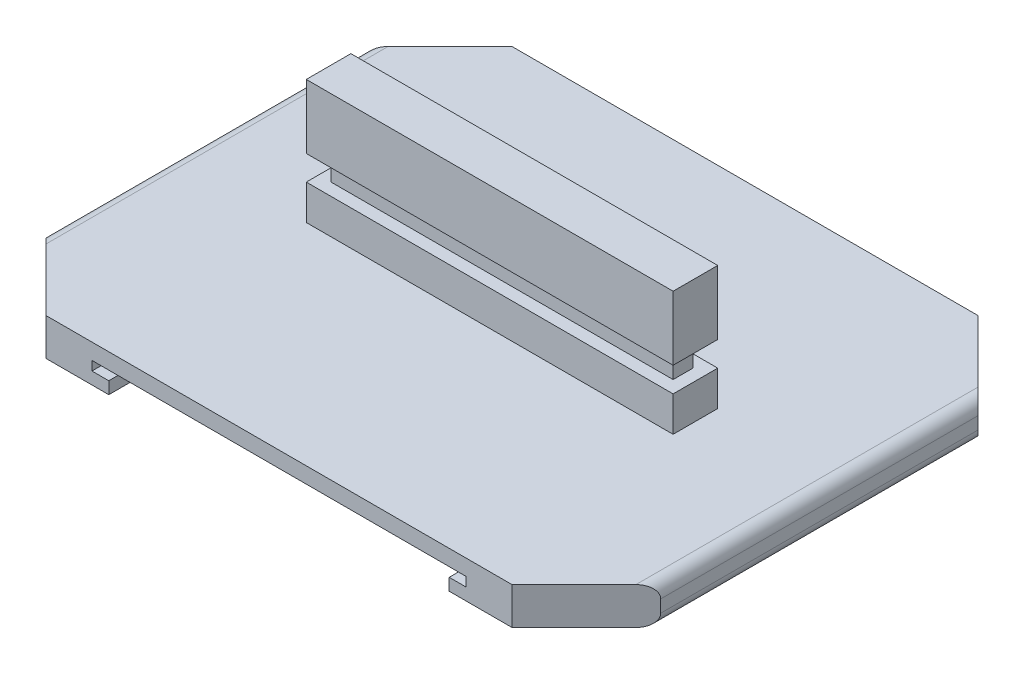
ISO-10303-21;
HEADER;
FILE_DESCRIPTION(('STEP AP214'),'2;1');
FILE_NAME('part.step','',(''),(''),'','','');
FILE_SCHEMA(('AUTOMOTIVE_DESIGN { 1 0 10303 214 1 1 1 1 }'));
ENDSEC;
DATA;
#1=APPLICATION_CONTEXT('core data for automotive mechanical design processes');
#2=APPLICATION_PROTOCOL_DEFINITION('international standard','automotive_design',2000,#1);
#3=PRODUCT_CONTEXT('',#1,'mechanical');
#4=PRODUCT('Part','Part','',(#3));
#5=PRODUCT_RELATED_PRODUCT_CATEGORY('part','',(#4));
#6=PRODUCT_DEFINITION_FORMATION('','',#4);
#7=PRODUCT_DEFINITION_CONTEXT('part definition',#1,'design');
#8=PRODUCT_DEFINITION('design','',#6,#7);
#9=PRODUCT_DEFINITION_SHAPE('','',#8);
#10=(LENGTH_UNIT() NAMED_UNIT(*) SI_UNIT(.MILLI.,.METRE.));
#11=(NAMED_UNIT(*) PLANE_ANGLE_UNIT() SI_UNIT($,.RADIAN.));
#12=(NAMED_UNIT(*) SI_UNIT($,.STERADIAN.) SOLID_ANGLE_UNIT());
#13=UNCERTAINTY_MEASURE_WITH_UNIT(LENGTH_MEASURE(1.E-05),#10,'distance_accuracy_value','');
#14=(GEOMETRIC_REPRESENTATION_CONTEXT(3) GLOBAL_UNCERTAINTY_ASSIGNED_CONTEXT((#13)) GLOBAL_UNIT_ASSIGNED_CONTEXT((#10,
#11,#12)) REPRESENTATION_CONTEXT('',''));
#15=CARTESIAN_POINT('',(0.,0.,0.));
#16=DIRECTION('',(0.,0.,1.));
#17=DIRECTION('',(1.,0.,0.));
#18=AXIS2_PLACEMENT_3D('',#15,#16,#17);
#19=CARTESIAN_POINT('',(0.,1.5,0.));
#20=DIRECTION('',(0.,-1.,0.));
#21=DIRECTION('',(0.,0.,-1.));
#22=AXIS2_PLACEMENT_3D('',#19,#20,#21);
#23=PLANE('',#22);
#24=DIRECTION('',(0.,0.,-1.));
#25=VECTOR('',#24,1.);
#26=CARTESIAN_POINT('',(7.4,1.5,0.9));
#27=LINE('',#26,#25);
#28=CARTESIAN_POINT('',(7.4,1.5,0.9));
#29=VERTEX_POINT('',#28);
#30=CARTESIAN_POINT('',(7.4,1.5,-0.9));
#31=VERTEX_POINT('',#30);
#32=EDGE_CURVE('E456',#29,#31,#27,.T.);
#33=ORIENTED_EDGE('',*,*,#32,.F.);
#34=DIRECTION('',(1.,0.,0.));
#35=VECTOR('',#34,1.);
#36=CARTESIAN_POINT('',(-7.4,1.5,0.9));
#37=LINE('',#36,#35);
#38=CARTESIAN_POINT('',(-7.4,1.5,0.9));
#39=VERTEX_POINT('',#38);
#40=EDGE_CURVE('E443',#39,#29,#37,.T.);
#41=ORIENTED_EDGE('',*,*,#40,.F.);
#42=DIRECTION('',(0.,0.,1.));
#43=VECTOR('',#42,1.);
#44=CARTESIAN_POINT('',(-7.4,1.5,0.9));
#45=LINE('',#44,#43);
#46=CARTESIAN_POINT('',(-7.4,1.5,-0.9));
#47=VERTEX_POINT('',#46);
#48=EDGE_CURVE('E448',#47,#39,#45,.T.);
#49=ORIENTED_EDGE('',*,*,#48,.F.);
#50=DIRECTION('',(-1.,0.,0.));
#51=VECTOR('',#50,1.);
#52=CARTESIAN_POINT('',(-7.4,1.5,-0.9));
#53=LINE('',#52,#51);
#54=EDGE_CURVE('E452',#31,#47,#53,.T.);
#55=ORIENTED_EDGE('',*,*,#54,.F.);
#56=EDGE_LOOP('',(#33,#41,#49,#55));
#57=FACE_BOUND('',#56,.T.);
#58=DIRECTION('',(0.707106781186547,0.,-0.707106781186548));
#59=VECTOR('',#58,1.);
#60=CARTESIAN_POINT('',(9.4,1.5,9.4));
#61=LINE('',#60,#59);
#62=CARTESIAN_POINT('',(9.4,1.5,9.4));
#63=VERTEX_POINT('',#62);
#64=CARTESIAN_POINT('',(11.9,1.5,6.9));
#65=VERTEX_POINT('',#64);
#66=EDGE_CURVE('E415',#63,#65,#61,.T.);
#67=ORIENTED_EDGE('',*,*,#66,.T.);
#68=DIRECTION('',(0.,0.,1.));
#69=VECTOR('',#68,1.);
#70=CARTESIAN_POINT('',(11.9,1.5,-10.1));
#71=LINE('',#70,#69);
#72=CARTESIAN_POINT('',(11.9,1.5,-6.9));
#73=VERTEX_POINT('',#72);
#74=EDGE_CURVE('E604',#73,#65,#71,.T.);
#75=ORIENTED_EDGE('',*,*,#74,.F.);
#76=DIRECTION('',(-0.707106781186547,0.,-0.707106781186548));
#77=VECTOR('',#76,1.);
#78=CARTESIAN_POINT('',(9.4,1.5,-9.4));
#79=LINE('',#78,#77);
#80=CARTESIAN_POINT('',(9.4,1.5,-9.4));
#81=VERTEX_POINT('',#80);
#82=EDGE_CURVE('E412',#73,#81,#79,.T.);
#83=ORIENTED_EDGE('',*,*,#82,.T.);
#84=DIRECTION('',(-1.,0.,0.));
#85=VECTOR('',#84,1.);
#86=CARTESIAN_POINT('',(-9.4,1.5,-9.4));
#87=LINE('',#86,#85);
#88=CARTESIAN_POINT('',(-9.4,1.5,-9.4));
#89=VERTEX_POINT('',#88);
#90=EDGE_CURVE('E389',#81,#89,#87,.T.);
#91=ORIENTED_EDGE('',*,*,#90,.T.);
#92=DIRECTION('',(-0.707106781186547,0.,0.707106781186548));
#93=VECTOR('',#92,1.);
#94=CARTESIAN_POINT('',(-12.4,1.5,-6.4));
#95=LINE('',#94,#93);
#96=CARTESIAN_POINT('',(-11.9,1.5,-6.9));
#97=VERTEX_POINT('',#96);
#98=EDGE_CURVE('E305',#89,#97,#95,.T.);
#99=ORIENTED_EDGE('',*,*,#98,.T.);
#100=DIRECTION('',(0.,0.,1.));
#101=VECTOR('',#100,1.);
#102=CARTESIAN_POINT('',(-11.9,1.5,-10.1));
#103=LINE('',#102,#101);
#104=CARTESIAN_POINT('',(-11.9,1.5,6.9));
#105=VERTEX_POINT('',#104);
#106=EDGE_CURVE('E67',#97,#105,#103,.T.);
#107=ORIENTED_EDGE('',*,*,#106,.T.);
#108=DIRECTION('',(0.707106781186547,0.,0.707106781186548));
#109=VECTOR('',#108,1.);
#110=CARTESIAN_POINT('',(-12.4,1.5,6.4));
#111=LINE('',#110,#109);
#112=CARTESIAN_POINT('',(-9.4,1.5,9.4));
#113=VERTEX_POINT('',#112);
#114=EDGE_CURVE('E299',#105,#113,#111,.T.);
#115=ORIENTED_EDGE('',*,*,#114,.T.);
#116=DIRECTION('',(1.,0.,0.));
#117=VECTOR('',#116,1.);
#118=CARTESIAN_POINT('',(-9.4,1.5,9.4));
#119=LINE('',#118,#117);
#120=EDGE_CURVE('E419',#113,#63,#119,.T.);
#121=ORIENTED_EDGE('',*,*,#120,.T.);
#122=EDGE_LOOP('',(#67,#75,#83,#91,#99,#107,#115,#121));
#123=FACE_BOUND('',#122,.T.);
#124=ADVANCED_FACE('F44',(#57,#123),#23,.F.);
#125=CARTESIAN_POINT('',(-12.4,1.5,6.4));
#126=DIRECTION('',(0.707106781186548,0.,-0.707106781186547));
#127=DIRECTION('',(-0.707106781186547,0.,-0.707106781186548));
#128=AXIS2_PLACEMENT_3D('',#125,#126,#127);
#129=PLANE('',#128);
#130=CARTESIAN_POINT('',(-11.9,0.5,6.9));
#131=DIRECTION('',(0.707106781186548,0.,-0.707106781186547));
#132=DIRECTION('',(0.707106781186547,0.,0.707106781186548));
#133=AXIS2_PLACEMENT_3D('',#130,#131,#132);
#134=ELLIPSE('',#133,0.707106781186548,0.5);
#135=CARTESIAN_POINT('',(-11.9,0.,6.9));
#136=VERTEX_POINT('',#135);
#137=CARTESIAN_POINT('',(-12.4,0.500000000000004,6.4));
#138=VERTEX_POINT('',#137);
#139=EDGE_CURVE('E590',#136,#138,#134,.T.);
#140=ORIENTED_EDGE('',*,*,#139,.F.);
#141=DIRECTION('',(0.707106781186547,0.,0.707106781186548));
#142=VECTOR('',#141,1.);
#143=CARTESIAN_POINT('',(-12.4,0.,6.4));
#144=LINE('',#143,#142);
#145=CARTESIAN_POINT('',(-9.4,0.,9.4));
#146=VERTEX_POINT('',#145);
#147=EDGE_CURVE('E378',#136,#146,#144,.T.);
#148=ORIENTED_EDGE('',*,*,#147,.T.);
#149=DIRECTION('',(0.,-1.,0.));
#150=VECTOR('',#149,1.);
#151=CARTESIAN_POINT('',(-9.4,1.5,9.4));
#152=LINE('',#151,#150);
#153=EDGE_CURVE('E322',#113,#146,#152,.T.);
#154=ORIENTED_EDGE('',*,*,#153,.F.);
#155=ORIENTED_EDGE('',*,*,#114,.F.);
#156=CARTESIAN_POINT('',(-11.9,1.,6.9));
#157=DIRECTION('',(0.707106781186548,0.,-0.707106781186547));
#158=DIRECTION('',(0.707106781186547,0.,0.707106781186548));
#159=AXIS2_PLACEMENT_3D('',#156,#157,#158);
#160=ELLIPSE('',#159,0.707106781186548,0.5);
#161=CARTESIAN_POINT('',(-12.4,0.999999999999997,6.4));
#162=VERTEX_POINT('',#161);
#163=EDGE_CURVE('E593',#105,#162,#160,.F.);
#164=ORIENTED_EDGE('',*,*,#163,.T.);
#165=DIRECTION('',(0.,-1.,0.));
#166=VECTOR('',#165,1.);
#167=CARTESIAN_POINT('',(-12.4,1.5,6.4));
#168=LINE('',#167,#166);
#169=EDGE_CURVE('E326',#162,#138,#168,.T.);
#170=ORIENTED_EDGE('',*,*,#169,.T.);
#171=EDGE_LOOP('',(#140,#148,#154,#155,#164,#170));
#172=FACE_BOUND('',#171,.T.);
#173=ADVANCED_FACE('F616',(#172),#129,.F.);
#174=CARTESIAN_POINT('',(12.4,1.5,6.4));
#175=DIRECTION('',(-1.,0.,0.));
#176=DIRECTION('',(0.,0.,1.));
#177=AXIS2_PLACEMENT_3D('',#174,#175,#176);
#178=PLANE('',#177);
#179=DIRECTION('',(0.,-1.,0.));
#180=VECTOR('',#179,1.);
#181=CARTESIAN_POINT('',(12.4,1.5,6.4));
#182=LINE('',#181,#180);
#183=CARTESIAN_POINT('',(12.4,0.999999999999997,6.4));
#184=VERTEX_POINT('',#183);
#185=CARTESIAN_POINT('',(12.4,0.500000000000004,6.4));
#186=VERTEX_POINT('',#185);
#187=EDGE_CURVE('E314',#184,#186,#182,.T.);
#188=ORIENTED_EDGE('',*,*,#187,.T.);
#189=DIRECTION('',(0.,0.,1.));
#190=VECTOR('',#189,1.);
#191=CARTESIAN_POINT('',(12.4,0.500000000000004,-10.1));
#192=LINE('',#191,#190);
#193=CARTESIAN_POINT('',(12.4,0.500000000000004,-6.4));
#194=VERTEX_POINT('',#193);
#195=EDGE_CURVE('E265',#194,#186,#192,.T.);
#196=ORIENTED_EDGE('',*,*,#195,.F.);
#197=DIRECTION('',(0.,-1.,0.));
#198=VECTOR('',#197,1.);
#199=CARTESIAN_POINT('',(12.4,1.5,-6.4));
#200=LINE('',#199,#198);
#201=CARTESIAN_POINT('',(12.4,1.,-6.4));
#202=VERTEX_POINT('',#201);
#203=EDGE_CURVE('E274',#202,#194,#200,.T.);
#204=ORIENTED_EDGE('',*,*,#203,.F.);
#205=DIRECTION('',(0.,0.,1.));
#206=VECTOR('',#205,1.);
#207=CARTESIAN_POINT('',(12.4,0.999999999999997,-10.1));
#208=LINE('',#207,#206);
#209=EDGE_CURVE('E60',#202,#184,#208,.T.);
#210=ORIENTED_EDGE('',*,*,#209,.T.);
#211=EDGE_LOOP('',(#188,#196,#204,#210));
#212=FACE_BOUND('',#211,.T.);
#213=ADVANCED_FACE('F636',(#212),#178,.F.);
#214=CARTESIAN_POINT('',(-12.4,1.5,-6.4));
#215=DIRECTION('',(0.707106781186548,0.,0.707106781186547));
#216=DIRECTION('',(0.707106781186547,0.,-0.707106781186548));
#217=AXIS2_PLACEMENT_3D('',#214,#215,#216);
#218=PLANE('',#217);
#219=CARTESIAN_POINT('',(-11.9,0.5,-6.9));
#220=DIRECTION('',(0.707106781186548,0.,0.707106781186547));
#221=DIRECTION('',(-0.707106781186547,0.,0.707106781186548));
#222=AXIS2_PLACEMENT_3D('',#219,#220,#221);
#223=ELLIPSE('',#222,0.707106781186548,0.5);
#224=CARTESIAN_POINT('',(-12.4,0.5,-6.4));
#225=VERTEX_POINT('',#224);
#226=CARTESIAN_POINT('',(-11.9,0.,-6.9));
#227=VERTEX_POINT('',#226);
#228=EDGE_CURVE('E53',#225,#227,#223,.T.);
#229=ORIENTED_EDGE('',*,*,#228,.F.);
#230=DIRECTION('',(0.,-1.,0.));
#231=VECTOR('',#230,1.);
#232=CARTESIAN_POINT('',(-12.4,1.5,-6.4));
#233=LINE('',#232,#231);
#234=CARTESIAN_POINT('',(-12.4,0.999999999999997,-6.4));
#235=VERTEX_POINT('',#234);
#236=EDGE_CURVE('E300',#235,#225,#233,.T.);
#237=ORIENTED_EDGE('',*,*,#236,.F.);
#238=CARTESIAN_POINT('',(-11.9,1.,-6.9));
#239=DIRECTION('',(0.707106781186548,0.,0.707106781186547));
#240=DIRECTION('',(-0.707106781186547,0.,0.707106781186548));
#241=AXIS2_PLACEMENT_3D('',#238,#239,#240);
#242=ELLIPSE('',#241,0.707106781186548,0.5);
#243=EDGE_CURVE('E361',#235,#97,#242,.F.);
#244=ORIENTED_EDGE('',*,*,#243,.T.);
#245=ORIENTED_EDGE('',*,*,#98,.F.);
#246=DIRECTION('',(0.,-1.,0.));
#247=VECTOR('',#246,1.);
#248=CARTESIAN_POINT('',(-9.4,1.5,-9.4));
#249=LINE('',#248,#247);
#250=CARTESIAN_POINT('',(-9.4,0.,-9.4));
#251=VERTEX_POINT('',#250);
#252=EDGE_CURVE('E304',#89,#251,#249,.T.);
#253=ORIENTED_EDGE('',*,*,#252,.T.);
#254=DIRECTION('',(-0.707106781186547,0.,0.707106781186548));
#255=VECTOR('',#254,1.);
#256=CARTESIAN_POINT('',(-12.4,0.,-6.4));
#257=LINE('',#256,#255);
#258=EDGE_CURVE('E295',#251,#227,#257,.T.);
#259=ORIENTED_EDGE('',*,*,#258,.T.);
#260=EDGE_LOOP('',(#229,#237,#244,#245,#253,#259));
#261=FACE_BOUND('',#260,.T.);
#262=ADVANCED_FACE('F381',(#261),#218,.F.);
#263=CARTESIAN_POINT('',(-9.4,1.5,9.4));
#264=DIRECTION('',(0.,0.,-1.));
#265=DIRECTION('',(-1.,0.,0.));
#266=AXIS2_PLACEMENT_3D('',#263,#264,#265);
#267=PLANE('',#266);
#268=DIRECTION('',(0.,1.,0.));
#269=VECTOR('',#268,1.);
#270=CARTESIAN_POINT('',(-6.86704008418104,0.,9.4));
#271=LINE('',#270,#269);
#272=CARTESIAN_POINT('',(-6.86704008418104,0.,9.4));
#273=VERTEX_POINT('',#272);
#274=CARTESIAN_POINT('',(-6.86704008418104,0.488052506575798,9.4));
#275=VERTEX_POINT('',#274);
#276=EDGE_CURVE('E398',#273,#275,#271,.T.);
#277=ORIENTED_EDGE('',*,*,#276,.T.);
#278=DIRECTION('',(-1.,0.,0.));
#279=VECTOR('',#278,1.);
#280=CARTESIAN_POINT('',(0.,0.488052506575798,9.4));
#281=LINE('',#280,#279);
#282=CARTESIAN_POINT('',(-7.54709683395956,0.488052506575798,9.4));
#283=VERTEX_POINT('',#282);
#284=EDGE_CURVE('E563',#275,#283,#281,.T.);
#285=ORIENTED_EDGE('',*,*,#284,.T.);
#286=DIRECTION('',(0.,-1.,0.));
#287=VECTOR('',#286,1.);
#288=CARTESIAN_POINT('',(-7.54709683395956,0.,9.4));
#289=LINE('',#288,#287);
#290=CARTESIAN_POINT('',(-7.54709683395956,0.859235202927271,9.4));
#291=VERTEX_POINT('',#290);
#292=EDGE_CURVE('E566',#291,#283,#289,.T.);
#293=ORIENTED_EDGE('',*,*,#292,.F.);
#294=DIRECTION('',(1.,0.,0.));
#295=VECTOR('',#294,1.);
#296=CARTESIAN_POINT('',(0.,0.859235202927271,9.4));
#297=LINE('',#296,#295);
#298=CARTESIAN_POINT('',(7.54709683395956,0.859235202927271,9.4));
#299=VERTEX_POINT('',#298);
#300=EDGE_CURVE('E570',#291,#299,#297,.T.);
#301=ORIENTED_EDGE('',*,*,#300,.T.);
#302=DIRECTION('',(0.,-1.,0.));
#303=VECTOR('',#302,1.);
#304=CARTESIAN_POINT('',(7.54709683395956,0.,9.4));
#305=LINE('',#304,#303);
#306=CARTESIAN_POINT('',(7.54709683395956,0.488052506575798,9.4));
#307=VERTEX_POINT('',#306);
#308=EDGE_CURVE('E574',#299,#307,#305,.T.);
#309=ORIENTED_EDGE('',*,*,#308,.T.);
#310=DIRECTION('',(1.,0.,0.));
#311=VECTOR('',#310,1.);
#312=CARTESIAN_POINT('',(0.,0.488052506575798,9.4));
#313=LINE('',#312,#311);
#314=CARTESIAN_POINT('',(6.86704008418104,0.488052506575798,9.4));
#315=VERTEX_POINT('',#314);
#316=EDGE_CURVE('E578',#315,#307,#313,.T.);
#317=ORIENTED_EDGE('',*,*,#316,.F.);
#318=DIRECTION('',(0.,1.,0.));
#319=VECTOR('',#318,1.);
#320=CARTESIAN_POINT('',(6.86704008418104,0.,9.4));
#321=LINE('',#320,#319);
#322=CARTESIAN_POINT('',(6.86704008418104,0.,9.4));
#323=VERTEX_POINT('',#322);
#324=EDGE_CURVE('E582',#323,#315,#321,.T.);
#325=ORIENTED_EDGE('',*,*,#324,.F.);
#326=DIRECTION('',(1.,0.,0.));
#327=VECTOR('',#326,1.);
#328=CARTESIAN_POINT('',(-9.4,0.,9.4));
#329=LINE('',#328,#327);
#330=CARTESIAN_POINT('',(9.4,0.,9.4));
#331=VERTEX_POINT('',#330);
#332=EDGE_CURVE('E402',#323,#331,#329,.T.);
#333=ORIENTED_EDGE('',*,*,#332,.T.);
#334=DIRECTION('',(0.,-1.,0.));
#335=VECTOR('',#334,1.);
#336=CARTESIAN_POINT('',(9.4,1.5,9.4));
#337=LINE('',#336,#335);
#338=EDGE_CURVE('E318',#63,#331,#337,.T.);
#339=ORIENTED_EDGE('',*,*,#338,.F.);
#340=ORIENTED_EDGE('',*,*,#120,.F.);
#341=ORIENTED_EDGE('',*,*,#153,.T.);
#342=EDGE_CURVE('E290',#146,#273,#329,.T.);
#343=ORIENTED_EDGE('',*,*,#342,.T.);
#344=EDGE_LOOP('',(#277,#285,#293,#301,#309,#317,#325,#333,#339,#340,#341,#343));
#345=FACE_BOUND('',#344,.T.);
#346=ADVANCED_FACE('F396',(#345),#267,.F.);
#347=CARTESIAN_POINT('',(-9.4,1.5,-9.4));
#348=DIRECTION('',(0.,0.,1.));
#349=DIRECTION('',(1.,0.,0.));
#350=AXIS2_PLACEMENT_3D('',#347,#348,#349);
#351=PLANE('',#350);
#352=DIRECTION('',(0.,1.,0.));
#353=VECTOR('',#352,1.);
#354=CARTESIAN_POINT('',(-6.86704008418104,1.5,-9.4));
#355=LINE('',#354,#353);
#356=CARTESIAN_POINT('',(-6.86704008418104,0.,-9.40000000000001));
#357=VERTEX_POINT('',#356);
#358=CARTESIAN_POINT('',(-6.86704008418104,0.488052506575798,-9.40000000000001));
#359=VERTEX_POINT('',#358);
#360=EDGE_CURVE('E391',#357,#359,#355,.T.);
#361=ORIENTED_EDGE('',*,*,#360,.F.);
#362=DIRECTION('',(-1.,0.,0.));
#363=VECTOR('',#362,1.);
#364=CARTESIAN_POINT('',(-9.4,0.,-9.4));
#365=LINE('',#364,#363);
#366=EDGE_CURVE('E284',#357,#251,#365,.T.);
#367=ORIENTED_EDGE('',*,*,#366,.T.);
#368=ORIENTED_EDGE('',*,*,#252,.F.);
#369=ORIENTED_EDGE('',*,*,#90,.F.);
#370=DIRECTION('',(0.,-1.,0.));
#371=VECTOR('',#370,1.);
#372=CARTESIAN_POINT('',(9.4,1.5,-9.4));
#373=LINE('',#372,#371);
#374=CARTESIAN_POINT('',(9.4,0.,-9.4));
#375=VERTEX_POINT('',#374);
#376=EDGE_CURVE('E309',#81,#375,#373,.T.);
#377=ORIENTED_EDGE('',*,*,#376,.T.);
#378=CARTESIAN_POINT('',(6.86704008418104,0.,-9.4));
#379=VERTEX_POINT('',#378);
#380=EDGE_CURVE('E282',#375,#379,#365,.T.);
#381=ORIENTED_EDGE('',*,*,#380,.T.);
#382=DIRECTION('',(0.,1.,0.));
#383=VECTOR('',#382,1.);
#384=CARTESIAN_POINT('',(6.86704008418104,1.5,-9.4));
#385=LINE('',#384,#383);
#386=CARTESIAN_POINT('',(6.86704008418104,0.488052506575798,-9.40000000000001));
#387=VERTEX_POINT('',#386);
#388=EDGE_CURVE('E539',#379,#387,#385,.T.);
#389=ORIENTED_EDGE('',*,*,#388,.T.);
#390=DIRECTION('',(1.,0.,0.));
#391=VECTOR('',#390,1.);
#392=CARTESIAN_POINT('',(-9.4,0.488052506575798,-9.4));
#393=LINE('',#392,#391);
#394=CARTESIAN_POINT('',(7.54709683395956,0.488052506575798,-9.40000000000001));
#395=VERTEX_POINT('',#394);
#396=EDGE_CURVE('E344',#387,#395,#393,.T.);
#397=ORIENTED_EDGE('',*,*,#396,.T.);
#398=DIRECTION('',(0.,-1.,0.));
#399=VECTOR('',#398,1.);
#400=CARTESIAN_POINT('',(7.54709683395956,1.5,-9.4));
#401=LINE('',#400,#399);
#402=CARTESIAN_POINT('',(7.54709683395956,0.859235202927271,-9.40000000000001));
#403=VERTEX_POINT('',#402);
#404=EDGE_CURVE('E348',#403,#395,#401,.T.);
#405=ORIENTED_EDGE('',*,*,#404,.F.);
#406=DIRECTION('',(1.,0.,0.));
#407=VECTOR('',#406,1.);
#408=CARTESIAN_POINT('',(-9.4,0.859235202927271,-9.4));
#409=LINE('',#408,#407);
#410=CARTESIAN_POINT('',(-7.54709683395956,0.859235202927271,-9.40000000000001));
#411=VERTEX_POINT('',#410);
#412=EDGE_CURVE('E351',#411,#403,#409,.T.);
#413=ORIENTED_EDGE('',*,*,#412,.F.);
#414=DIRECTION('',(0.,-1.,0.));
#415=VECTOR('',#414,1.);
#416=CARTESIAN_POINT('',(-7.54709683395956,1.5,-9.4));
#417=LINE('',#416,#415);
#418=CARTESIAN_POINT('',(-7.54709683395956,0.488052506575798,-9.40000000000001));
#419=VERTEX_POINT('',#418);
#420=EDGE_CURVE('E354',#411,#419,#417,.T.);
#421=ORIENTED_EDGE('',*,*,#420,.T.);
#422=DIRECTION('',(-1.,0.,0.));
#423=VECTOR('',#422,1.);
#424=CARTESIAN_POINT('',(-9.4,0.488052506575798,-9.4));
#425=LINE('',#424,#423);
#426=EDGE_CURVE('E358',#359,#419,#425,.T.);
#427=ORIENTED_EDGE('',*,*,#426,.F.);
#428=EDGE_LOOP('',(#361,#367,#368,#369,#377,#381,#389,#397,#405,#413,#421,#427));
#429=FACE_BOUND('',#428,.T.);
#430=ADVANCED_FACE('F388',(#429),#351,.F.);
#431=CARTESIAN_POINT('',(0.,0.,0.));
#432=DIRECTION('',(0.,-1.,0.));
#433=DIRECTION('',(0.,0.,-1.));
#434=AXIS2_PLACEMENT_3D('',#431,#432,#433);
#435=PLANE('',#434);
#436=DIRECTION('',(0.,0.,1.));
#437=VECTOR('',#436,1.);
#438=CARTESIAN_POINT('',(-11.9,0.,-10.1));
#439=LINE('',#438,#437);
#440=EDGE_CURVE('E264',#227,#136,#439,.T.);
#441=ORIENTED_EDGE('',*,*,#440,.F.);
#442=ORIENTED_EDGE('',*,*,#258,.F.);
#443=ORIENTED_EDGE('',*,*,#366,.F.);
#444=DIRECTION('',(0.,0.,1.));
#445=VECTOR('',#444,1.);
#446=CARTESIAN_POINT('',(-6.86704008418104,0.,0.));
#447=LINE('',#446,#445);
#448=EDGE_CURVE('E340',#357,#273,#447,.T.);
#449=ORIENTED_EDGE('',*,*,#448,.T.);
#450=ORIENTED_EDGE('',*,*,#342,.F.);
#451=ORIENTED_EDGE('',*,*,#147,.F.);
#452=EDGE_LOOP('',(#441,#442,#443,#449,#450,#451));
#453=FACE_BOUND('',#452,.T.);
#454=ADVANCED_FACE('F375',(#453),#435,.T.);
#455=CARTESIAN_POINT('',(-12.4,1.5,6.4));
#456=DIRECTION('',(1.,0.,0.));
#457=DIRECTION('',(0.,0.,-1.));
#458=AXIS2_PLACEMENT_3D('',#455,#456,#457);
#459=PLANE('',#458);
#460=ORIENTED_EDGE('',*,*,#236,.T.);
#461=DIRECTION('',(0.,0.,1.));
#462=VECTOR('',#461,1.);
#463=CARTESIAN_POINT('',(-12.4,0.500000000000004,-10.1));
#464=LINE('',#463,#462);
#465=EDGE_CURVE('E276',#225,#138,#464,.T.);
#466=ORIENTED_EDGE('',*,*,#465,.T.);
#467=ORIENTED_EDGE('',*,*,#169,.F.);
#468=DIRECTION('',(0.,0.,1.));
#469=VECTOR('',#468,1.);
#470=CARTESIAN_POINT('',(-12.4,0.999999999999997,-10.1));
#471=LINE('',#470,#469);
#472=EDGE_CURVE('E599',#235,#162,#471,.T.);
#473=ORIENTED_EDGE('',*,*,#472,.F.);
#474=EDGE_LOOP('',(#460,#466,#467,#473));
#475=FACE_BOUND('',#474,.T.);
#476=ADVANCED_FACE('F46',(#475),#459,.F.);
#477=CARTESIAN_POINT('',(9.4,1.5,9.4));
#478=DIRECTION('',(-0.707106781186548,0.,-0.707106781186547));
#479=DIRECTION('',(-0.707106781186547,0.,0.707106781186548));
#480=AXIS2_PLACEMENT_3D('',#477,#478,#479);
#481=PLANE('',#480);
#482=DIRECTION('',(0.707106781186547,0.,-0.707106781186548));
#483=VECTOR('',#482,1.);
#484=CARTESIAN_POINT('',(9.4,0.,9.4));
#485=LINE('',#484,#483);
#486=CARTESIAN_POINT('',(11.9,0.,6.9));
#487=VERTEX_POINT('',#486);
#488=EDGE_CURVE('E285',#331,#487,#485,.T.);
#489=ORIENTED_EDGE('',*,*,#488,.T.);
#490=CARTESIAN_POINT('',(11.9,0.5,6.9));
#491=DIRECTION('',(-0.707106781186548,0.,-0.707106781186547));
#492=DIRECTION('',(-0.707106781186547,0.,0.707106781186548));
#493=AXIS2_PLACEMENT_3D('',#490,#491,#492);
#494=ELLIPSE('',#493,0.707106781186548,0.5);
#495=EDGE_CURVE('E258',#487,#186,#494,.F.);
#496=ORIENTED_EDGE('',*,*,#495,.T.);
#497=ORIENTED_EDGE('',*,*,#187,.F.);
#498=CARTESIAN_POINT('',(11.9,1.,6.9));
#499=DIRECTION('',(-0.707106781186548,0.,-0.707106781186547));
#500=DIRECTION('',(-0.707106781186547,0.,0.707106781186548));
#501=AXIS2_PLACEMENT_3D('',#498,#499,#500);
#502=ELLIPSE('',#501,0.707106781186548,0.5);
#503=EDGE_CURVE('E586',#184,#65,#502,.F.);
#504=ORIENTED_EDGE('',*,*,#503,.T.);
#505=ORIENTED_EDGE('',*,*,#66,.F.);
#506=ORIENTED_EDGE('',*,*,#338,.T.);
#507=EDGE_LOOP('',(#489,#496,#497,#504,#505,#506));
#508=FACE_BOUND('',#507,.T.);
#509=ADVANCED_FACE('F632',(#508),#481,.F.);
#510=CARTESIAN_POINT('',(9.4,1.5,-9.4));
#511=DIRECTION('',(-0.707106781186548,0.,0.707106781186547));
#512=DIRECTION('',(0.707106781186547,0.,0.707106781186548));
#513=AXIS2_PLACEMENT_3D('',#510,#511,#512);
#514=PLANE('',#513);
#515=ORIENTED_EDGE('',*,*,#203,.T.);
#516=CARTESIAN_POINT('',(11.9,0.5,-6.9));
#517=DIRECTION('',(-0.707106781186548,0.,0.707106781186547));
#518=DIRECTION('',(0.707106781186547,0.,0.707106781186548));
#519=AXIS2_PLACEMENT_3D('',#516,#517,#518);
#520=ELLIPSE('',#519,0.707106781186548,0.5);
#521=CARTESIAN_POINT('',(11.9,0.,-6.9));
#522=VERTEX_POINT('',#521);
#523=EDGE_CURVE('E255',#194,#522,#520,.F.);
#524=ORIENTED_EDGE('',*,*,#523,.T.);
#525=DIRECTION('',(-0.707106781186547,0.,-0.707106781186548));
#526=VECTOR('',#525,1.);
#527=CARTESIAN_POINT('',(9.4,0.,-9.4));
#528=LINE('',#527,#526);
#529=EDGE_CURVE('E271',#522,#375,#528,.T.);
#530=ORIENTED_EDGE('',*,*,#529,.T.);
#531=ORIENTED_EDGE('',*,*,#376,.F.);
#532=ORIENTED_EDGE('',*,*,#82,.F.);
#533=CARTESIAN_POINT('',(11.9,1.,-6.9));
#534=DIRECTION('',(-0.707106781186548,0.,0.707106781186547));
#535=DIRECTION('',(0.707106781186547,0.,0.707106781186548));
#536=AXIS2_PLACEMENT_3D('',#533,#534,#535);
#537=ELLIPSE('',#536,0.707106781186548,0.5);
#538=EDGE_CURVE('E11',#73,#202,#537,.F.);
#539=ORIENTED_EDGE('',*,*,#538,.T.);
#540=EDGE_LOOP('',(#515,#524,#530,#531,#532,#539));
#541=FACE_BOUND('',#540,.T.);
#542=ADVANCED_FACE('F269',(#541),#514,.F.);
#543=DIRECTION('',(0.,0.,1.));
#544=VECTOR('',#543,1.);
#545=CARTESIAN_POINT('',(11.9,0.,-10.1));
#546=LINE('',#545,#544);
#547=EDGE_CURVE('E252',#522,#487,#546,.T.);
#548=ORIENTED_EDGE('',*,*,#547,.T.);
#549=ORIENTED_EDGE('',*,*,#488,.F.);
#550=ORIENTED_EDGE('',*,*,#332,.F.);
#551=DIRECTION('',(0.,0.,1.));
#552=VECTOR('',#551,1.);
#553=CARTESIAN_POINT('',(6.86704008418104,0.,0.));
#554=LINE('',#553,#552);
#555=EDGE_CURVE('E337',#379,#323,#554,.T.);
#556=ORIENTED_EDGE('',*,*,#555,.F.);
#557=ORIENTED_EDGE('',*,*,#380,.F.);
#558=ORIENTED_EDGE('',*,*,#529,.F.);
#559=EDGE_LOOP('',(#548,#549,#550,#556,#557,#558));
#560=FACE_BOUND('',#559,.T.);
#561=ADVANCED_FACE('F279',(#560),#435,.T.);
#562=CARTESIAN_POINT('',(7.4,6.5,0.9));
#563=DIRECTION('',(-1.,0.,0.));
#564=DIRECTION('',(0.,0.,1.));
#565=AXIS2_PLACEMENT_3D('',#562,#563,#564);
#566=PLANE('',#565);
#567=DIRECTION('',(0.,-1.,0.));
#568=VECTOR('',#567,1.);
#569=CARTESIAN_POINT('',(7.4,6.5,-0.9));
#570=LINE('',#569,#568);
#571=CARTESIAN_POINT('',(7.4,2.91262081717392,-0.9));
#572=VERTEX_POINT('',#571);
#573=EDGE_CURVE('E427',#572,#31,#570,.T.);
#574=ORIENTED_EDGE('',*,*,#573,.F.);
#575=DIRECTION('',(0.,0.,1.));
#576=VECTOR('',#575,1.);
#577=CARTESIAN_POINT('',(7.4,2.91262081717392,0.9));
#578=LINE('',#577,#576);
#579=CARTESIAN_POINT('',(7.4,2.91262081717392,0.9));
#580=VERTEX_POINT('',#579);
#581=EDGE_CURVE('E460',#572,#580,#578,.T.);
#582=ORIENTED_EDGE('',*,*,#581,.T.);
#583=DIRECTION('',(0.,-1.,0.));
#584=VECTOR('',#583,1.);
#585=CARTESIAN_POINT('',(7.4,6.5,0.9));
#586=LINE('',#585,#584);
#587=EDGE_CURVE('E442',#580,#29,#586,.T.);
#588=ORIENTED_EDGE('',*,*,#587,.T.);
#589=ORIENTED_EDGE('',*,*,#32,.T.);
#590=EDGE_LOOP('',(#574,#582,#588,#589));
#591=FACE_BOUND('',#590,.T.);
#592=ADVANCED_FACE('F654',(#591),#566,.F.);
#593=CARTESIAN_POINT('',(-7.4,6.5,-0.9));
#594=DIRECTION('',(0.,0.,1.));
#595=DIRECTION('',(1.,0.,0.));
#596=AXIS2_PLACEMENT_3D('',#593,#594,#595);
#597=PLANE('',#596);
#598=DIRECTION('',(0.,-1.,0.));
#599=VECTOR('',#598,1.);
#600=CARTESIAN_POINT('',(-7.4,6.5,-0.9));
#601=LINE('',#600,#599);
#602=CARTESIAN_POINT('',(-7.4,2.91262081717392,-0.9));
#603=VERTEX_POINT('',#602);
#604=EDGE_CURVE('E432',#603,#47,#601,.T.);
#605=ORIENTED_EDGE('',*,*,#604,.F.);
#606=DIRECTION('',(1.,0.,0.));
#607=VECTOR('',#606,1.);
#608=CARTESIAN_POINT('',(-7.4,2.91262081717392,-0.9));
#609=LINE('',#608,#607);
#610=EDGE_CURVE('E476',#603,#572,#609,.T.);
#611=ORIENTED_EDGE('',*,*,#610,.T.);
#612=ORIENTED_EDGE('',*,*,#573,.T.);
#613=ORIENTED_EDGE('',*,*,#54,.T.);
#614=EDGE_LOOP('',(#605,#611,#612,#613));
#615=FACE_BOUND('',#614,.T.);
#616=ADVANCED_FACE('F802',(#615),#597,.F.);
#617=CARTESIAN_POINT('',(-7.4,6.5,0.9));
#618=DIRECTION('',(1.,0.,0.));
#619=DIRECTION('',(0.,0.,-1.));
#620=AXIS2_PLACEMENT_3D('',#617,#618,#619);
#621=PLANE('',#620);
#622=DIRECTION('',(0.,-1.,0.));
#623=VECTOR('',#622,1.);
#624=CARTESIAN_POINT('',(-7.4,6.5,0.9));
#625=LINE('',#624,#623);
#626=CARTESIAN_POINT('',(-7.4,2.91262081717392,0.9));
#627=VERTEX_POINT('',#626);
#628=EDGE_CURVE('E437',#627,#39,#625,.T.);
#629=ORIENTED_EDGE('',*,*,#628,.F.);
#630=DIRECTION('',(0.,0.,-1.));
#631=VECTOR('',#630,1.);
#632=CARTESIAN_POINT('',(-7.4,2.91262081717392,0.9));
#633=LINE('',#632,#631);
#634=EDGE_CURVE('E480',#627,#603,#633,.T.);
#635=ORIENTED_EDGE('',*,*,#634,.T.);
#636=ORIENTED_EDGE('',*,*,#604,.T.);
#637=ORIENTED_EDGE('',*,*,#48,.T.);
#638=EDGE_LOOP('',(#629,#635,#636,#637));
#639=FACE_BOUND('',#638,.T.);
#640=ADVANCED_FACE('F799',(#639),#621,.F.);
#641=CARTESIAN_POINT('',(-7.4,6.5,0.9));
#642=DIRECTION('',(0.,0.,-1.));
#643=DIRECTION('',(-1.,0.,0.));
#644=AXIS2_PLACEMENT_3D('',#641,#642,#643);
#645=PLANE('',#644);
#646=ORIENTED_EDGE('',*,*,#587,.F.);
#647=DIRECTION('',(-1.,0.,0.));
#648=VECTOR('',#647,1.);
#649=CARTESIAN_POINT('',(-7.4,2.91262081717392,0.9));
#650=LINE('',#649,#648);
#651=EDGE_CURVE('E333',#580,#627,#650,.T.);
#652=ORIENTED_EDGE('',*,*,#651,.T.);
#653=ORIENTED_EDGE('',*,*,#628,.T.);
#654=ORIENTED_EDGE('',*,*,#40,.T.);
#655=EDGE_LOOP('',(#646,#652,#653,#654));
#656=FACE_BOUND('',#655,.T.);
#657=ADVANCED_FACE('F791',(#656),#645,.F.);
#658=CARTESIAN_POINT('',(0.,2.91262081717392,0.));
#659=DIRECTION('',(0.,-1.,0.));
#660=DIRECTION('',(0.,0.,-1.));
#661=AXIS2_PLACEMENT_3D('',#658,#659,#660);
#662=PLANE('',#661);
#663=DIRECTION('',(0.,0.,-1.));
#664=VECTOR('',#663,1.);
#665=CARTESIAN_POINT('',(6.9,2.91262081717392,0.4));
#666=LINE('',#665,#664);
#667=CARTESIAN_POINT('',(6.9,2.91262081717392,0.4));
#668=VERTEX_POINT('',#667);
#669=CARTESIAN_POINT('',(6.9,2.91262081717392,-0.4));
#670=VERTEX_POINT('',#669);
#671=EDGE_CURVE('E517',#668,#670,#666,.T.);
#672=ORIENTED_EDGE('',*,*,#671,.F.);
#673=DIRECTION('',(1.,0.,0.));
#674=VECTOR('',#673,1.);
#675=CARTESIAN_POINT('',(-6.9,2.91262081717392,0.4));
#676=LINE('',#675,#674);
#677=CARTESIAN_POINT('',(-6.9,2.91262081717392,0.4));
#678=VERTEX_POINT('',#677);
#679=EDGE_CURVE('E498',#678,#668,#676,.T.);
#680=ORIENTED_EDGE('',*,*,#679,.F.);
#681=DIRECTION('',(0.,0.,1.));
#682=VECTOR('',#681,1.);
#683=CARTESIAN_POINT('',(-6.9,2.91262081717392,0.4));
#684=LINE('',#683,#682);
#685=CARTESIAN_POINT('',(-6.9,2.91262081717392,-0.4));
#686=VERTEX_POINT('',#685);
#687=EDGE_CURVE('E509',#686,#678,#684,.T.);
#688=ORIENTED_EDGE('',*,*,#687,.F.);
#689=DIRECTION('',(-1.,0.,0.));
#690=VECTOR('',#689,1.);
#691=CARTESIAN_POINT('',(-6.9,2.91262081717392,-0.4));
#692=LINE('',#691,#690);
#693=EDGE_CURVE('E513',#670,#686,#692,.T.);
#694=ORIENTED_EDGE('',*,*,#693,.F.);
#695=EDGE_LOOP('',(#672,#680,#688,#694));
#696=FACE_BOUND('',#695,.T.);
#697=ORIENTED_EDGE('',*,*,#610,.F.);
#698=ORIENTED_EDGE('',*,*,#634,.F.);
#699=ORIENTED_EDGE('',*,*,#651,.F.);
#700=ORIENTED_EDGE('',*,*,#581,.F.);
#701=EDGE_LOOP('',(#697,#698,#699,#700));
#702=FACE_BOUND('',#701,.T.);
#703=ADVANCED_FACE('F771',(#696,#702),#662,.F.);
#704=CARTESIAN_POINT('',(0.,3.91262081717392,0.));
#705=DIRECTION('',(0.,-1.,0.));
#706=DIRECTION('',(0.,0.,-1.));
#707=AXIS2_PLACEMENT_3D('',#704,#705,#706);
#708=PLANE('',#707);
#709=DIRECTION('',(0.,0.,-1.));
#710=VECTOR('',#709,1.);
#711=CARTESIAN_POINT('',(6.9,3.91262081717392,0.4));
#712=LINE('',#711,#710);
#713=CARTESIAN_POINT('',(6.9,3.91262081717392,0.4));
#714=VERTEX_POINT('',#713);
#715=CARTESIAN_POINT('',(6.9,3.91262081717392,-0.4));
#716=VERTEX_POINT('',#715);
#717=EDGE_CURVE('E533',#714,#716,#712,.T.);
#718=ORIENTED_EDGE('',*,*,#717,.T.);
#719=DIRECTION('',(-1.,0.,0.));
#720=VECTOR('',#719,1.);
#721=CARTESIAN_POINT('',(-6.9,3.91262081717392,-0.4));
#722=LINE('',#721,#720);
#723=CARTESIAN_POINT('',(-6.9,3.91262081717392,-0.4));
#724=VERTEX_POINT('',#723);
#725=EDGE_CURVE('E529',#716,#724,#722,.T.);
#726=ORIENTED_EDGE('',*,*,#725,.T.);
#727=DIRECTION('',(0.,0.,1.));
#728=VECTOR('',#727,1.);
#729=CARTESIAN_POINT('',(-6.9,3.91262081717392,0.4));
#730=LINE('',#729,#728);
#731=CARTESIAN_POINT('',(-6.9,3.91262081717392,0.4));
#732=VERTEX_POINT('',#731);
#733=EDGE_CURVE('E525',#724,#732,#730,.T.);
#734=ORIENTED_EDGE('',*,*,#733,.T.);
#735=DIRECTION('',(1.,0.,0.));
#736=VECTOR('',#735,1.);
#737=CARTESIAN_POINT('',(-6.9,3.91262081717392,0.4));
#738=LINE('',#737,#736);
#739=EDGE_CURVE('E521',#732,#714,#738,.T.);
#740=ORIENTED_EDGE('',*,*,#739,.T.);
#741=EDGE_LOOP('',(#718,#726,#734,#740));
#742=FACE_BOUND('',#741,.T.);
#743=DIRECTION('',(0.,0.,1.));
#744=VECTOR('',#743,1.);
#745=CARTESIAN_POINT('',(7.4,3.91262081717392,0.9));
#746=LINE('',#745,#744);
#747=CARTESIAN_POINT('',(7.4,3.91262081717392,-0.9));
#748=VERTEX_POINT('',#747);
#749=CARTESIAN_POINT('',(7.4,3.91262081717392,0.9));
#750=VERTEX_POINT('',#749);
#751=EDGE_CURVE('E484',#748,#750,#746,.T.);
#752=ORIENTED_EDGE('',*,*,#751,.T.);
#753=DIRECTION('',(-1.,0.,0.));
#754=VECTOR('',#753,1.);
#755=CARTESIAN_POINT('',(-7.4,3.91262081717392,0.9));
#756=LINE('',#755,#754);
#757=CARTESIAN_POINT('',(-7.4,3.91262081717392,0.9));
#758=VERTEX_POINT('',#757);
#759=EDGE_CURVE('E330',#750,#758,#756,.T.);
#760=ORIENTED_EDGE('',*,*,#759,.T.);
#761=DIRECTION('',(0.,0.,-1.));
#762=VECTOR('',#761,1.);
#763=CARTESIAN_POINT('',(-7.4,3.91262081717392,0.9));
#764=LINE('',#763,#762);
#765=CARTESIAN_POINT('',(-7.4,3.91262081717392,-0.9));
#766=VERTEX_POINT('',#765);
#767=EDGE_CURVE('E490',#758,#766,#764,.T.);
#768=ORIENTED_EDGE('',*,*,#767,.T.);
#769=DIRECTION('',(1.,0.,0.));
#770=VECTOR('',#769,1.);
#771=CARTESIAN_POINT('',(-7.4,3.91262081717392,-0.9));
#772=LINE('',#771,#770);
#773=EDGE_CURVE('E487',#766,#748,#772,.T.);
#774=ORIENTED_EDGE('',*,*,#773,.T.);
#775=EDGE_LOOP('',(#752,#760,#768,#774));
#776=FACE_BOUND('',#775,.T.);
#777=ADVANCED_FACE('F767',(#742,#776),#708,.T.);
#778=CARTESIAN_POINT('',(6.9,2.91262081717392,0.4));
#779=DIRECTION('',(1.,0.,0.));
#780=DIRECTION('',(0.,0.,-1.));
#781=AXIS2_PLACEMENT_3D('',#778,#779,#780);
#782=PLANE('',#781);
#783=DIRECTION('',(0.,1.,0.));
#784=VECTOR('',#783,1.);
#785=CARTESIAN_POINT('',(6.9,2.91262081717392,0.4));
#786=LINE('',#785,#784);
#787=EDGE_CURVE('E493',#668,#714,#786,.T.);
#788=ORIENTED_EDGE('',*,*,#787,.F.);
#789=ORIENTED_EDGE('',*,*,#671,.T.);
#790=DIRECTION('',(0.,1.,0.));
#791=VECTOR('',#790,1.);
#792=CARTESIAN_POINT('',(6.9,2.91262081717392,-0.4));
#793=LINE('',#792,#791);
#794=EDGE_CURVE('E494',#670,#716,#793,.T.);
#795=ORIENTED_EDGE('',*,*,#794,.T.);
#796=ORIENTED_EDGE('',*,*,#717,.F.);
#797=EDGE_LOOP('',(#788,#789,#795,#796));
#798=FACE_BOUND('',#797,.T.);
#799=ADVANCED_FACE('F770',(#798),#782,.T.);
#800=CARTESIAN_POINT('',(-6.9,2.91262081717392,0.4));
#801=DIRECTION('',(0.,0.,1.));
#802=DIRECTION('',(1.,0.,0.));
#803=AXIS2_PLACEMENT_3D('',#800,#801,#802);
#804=PLANE('',#803);
#805=DIRECTION('',(0.,1.,0.));
#806=VECTOR('',#805,1.);
#807=CARTESIAN_POINT('',(-6.9,2.91262081717392,0.4));
#808=LINE('',#807,#806);
#809=EDGE_CURVE('E501',#678,#732,#808,.T.);
#810=ORIENTED_EDGE('',*,*,#809,.F.);
#811=ORIENTED_EDGE('',*,*,#679,.T.);
#812=ORIENTED_EDGE('',*,*,#787,.T.);
#813=ORIENTED_EDGE('',*,*,#739,.F.);
#814=EDGE_LOOP('',(#810,#811,#812,#813));
#815=FACE_BOUND('',#814,.T.);
#816=ADVANCED_FACE('F773',(#815),#804,.T.);
#817=CARTESIAN_POINT('',(-6.9,2.91262081717392,0.4));
#818=DIRECTION('',(-1.,0.,0.));
#819=DIRECTION('',(0.,0.,1.));
#820=AXIS2_PLACEMENT_3D('',#817,#818,#819);
#821=PLANE('',#820);
#822=DIRECTION('',(0.,1.,0.));
#823=VECTOR('',#822,1.);
#824=CARTESIAN_POINT('',(-6.9,2.91262081717392,-0.4));
#825=LINE('',#824,#823);
#826=EDGE_CURVE('E497',#686,#724,#825,.T.);
#827=ORIENTED_EDGE('',*,*,#826,.F.);
#828=ORIENTED_EDGE('',*,*,#687,.T.);
#829=ORIENTED_EDGE('',*,*,#809,.T.);
#830=ORIENTED_EDGE('',*,*,#733,.F.);
#831=EDGE_LOOP('',(#827,#828,#829,#830));
#832=FACE_BOUND('',#831,.T.);
#833=ADVANCED_FACE('F776',(#832),#821,.T.);
#834=CARTESIAN_POINT('',(-6.9,2.91262081717392,-0.4));
#835=DIRECTION('',(0.,0.,-1.));
#836=DIRECTION('',(-1.,0.,0.));
#837=AXIS2_PLACEMENT_3D('',#834,#835,#836);
#838=PLANE('',#837);
#839=ORIENTED_EDGE('',*,*,#794,.F.);
#840=ORIENTED_EDGE('',*,*,#693,.T.);
#841=ORIENTED_EDGE('',*,*,#826,.T.);
#842=ORIENTED_EDGE('',*,*,#725,.F.);
#843=EDGE_LOOP('',(#839,#840,#841,#842));
#844=FACE_BOUND('',#843,.T.);
#845=ADVANCED_FACE('F780',(#844),#838,.T.);
#846=CARTESIAN_POINT('',(0.,6.5,0.));
#847=DIRECTION('',(0.,-1.,0.));
#848=DIRECTION('',(0.,0.,-1.));
#849=AXIS2_PLACEMENT_3D('',#846,#847,#848);
#850=PLANE('',#849);
#851=DIRECTION('',(0.,0.,-1.));
#852=VECTOR('',#851,1.);
#853=CARTESIAN_POINT('',(7.4,6.5,0.9));
#854=LINE('',#853,#852);
#855=CARTESIAN_POINT('',(7.4,6.5,0.9));
#856=VERTEX_POINT('',#855);
#857=CARTESIAN_POINT('',(7.4,6.5,-0.9));
#858=VERTEX_POINT('',#857);
#859=EDGE_CURVE('E447',#856,#858,#854,.T.);
#860=ORIENTED_EDGE('',*,*,#859,.T.);
#861=DIRECTION('',(-1.,0.,0.));
#862=VECTOR('',#861,1.);
#863=CARTESIAN_POINT('',(-7.4,6.5,-0.9));
#864=LINE('',#863,#862);
#865=CARTESIAN_POINT('',(-7.4,6.5,-0.9));
#866=VERTEX_POINT('',#865);
#867=EDGE_CURVE('E467',#858,#866,#864,.T.);
#868=ORIENTED_EDGE('',*,*,#867,.T.);
#869=DIRECTION('',(0.,0.,1.));
#870=VECTOR('',#869,1.);
#871=CARTESIAN_POINT('',(-7.4,6.5,0.9));
#872=LINE('',#871,#870);
#873=CARTESIAN_POINT('',(-7.4,6.5,0.9));
#874=VERTEX_POINT('',#873);
#875=EDGE_CURVE('E464',#866,#874,#872,.T.);
#876=ORIENTED_EDGE('',*,*,#875,.T.);
#877=DIRECTION('',(1.,0.,0.));
#878=VECTOR('',#877,1.);
#879=CARTESIAN_POINT('',(-7.4,6.5,0.9));
#880=LINE('',#879,#878);
#881=EDGE_CURVE('E461',#874,#856,#880,.T.);
#882=ORIENTED_EDGE('',*,*,#881,.T.);
#883=EDGE_LOOP('',(#860,#868,#876,#882));
#884=FACE_BOUND('',#883,.T.);
#885=ADVANCED_FACE('F784',(#884),#850,.F.);
#886=ORIENTED_EDGE('',*,*,#759,.F.);
#887=EDGE_CURVE('E438',#856,#750,#586,.T.);
#888=ORIENTED_EDGE('',*,*,#887,.F.);
#889=ORIENTED_EDGE('',*,*,#881,.F.);
#890=EDGE_CURVE('E433',#874,#758,#625,.T.);
#891=ORIENTED_EDGE('',*,*,#890,.T.);
#892=EDGE_LOOP('',(#886,#888,#889,#891));
#893=FACE_BOUND('',#892,.T.);
#894=ADVANCED_FACE('F795',(#893),#645,.F.);
#895=ORIENTED_EDGE('',*,*,#767,.F.);
#896=ORIENTED_EDGE('',*,*,#890,.F.);
#897=ORIENTED_EDGE('',*,*,#875,.F.);
#898=EDGE_CURVE('E428',#866,#766,#601,.T.);
#899=ORIENTED_EDGE('',*,*,#898,.T.);
#900=EDGE_LOOP('',(#895,#896,#897,#899));
#901=FACE_BOUND('',#900,.T.);
#902=ADVANCED_FACE('F804',(#901),#621,.F.);
#903=ORIENTED_EDGE('',*,*,#773,.F.);
#904=ORIENTED_EDGE('',*,*,#898,.F.);
#905=ORIENTED_EDGE('',*,*,#867,.F.);
#906=EDGE_CURVE('E407',#858,#748,#570,.T.);
#907=ORIENTED_EDGE('',*,*,#906,.T.);
#908=EDGE_LOOP('',(#903,#904,#905,#907));
#909=FACE_BOUND('',#908,.T.);
#910=ADVANCED_FACE('F807',(#909),#597,.F.);
#911=ORIENTED_EDGE('',*,*,#751,.F.);
#912=ORIENTED_EDGE('',*,*,#906,.F.);
#913=ORIENTED_EDGE('',*,*,#859,.F.);
#914=ORIENTED_EDGE('',*,*,#887,.T.);
#915=EDGE_LOOP('',(#911,#912,#913,#914));
#916=FACE_BOUND('',#915,.T.);
#917=ADVANCED_FACE('F750',(#916),#566,.F.);
#918=CARTESIAN_POINT('',(0.,0.488052506575798,-108.1));
#919=DIRECTION('',(0.,1.,0.));
#920=DIRECTION('',(0.,0.,1.));
#921=AXIS2_PLACEMENT_3D('',#918,#919,#920);
#922=PLANE('',#921);
#923=ORIENTED_EDGE('',*,*,#426,.T.);
#924=DIRECTION('',(0.,0.,1.));
#925=VECTOR('',#924,1.);
#926=CARTESIAN_POINT('',(-7.54709683395956,0.488052506575798,-108.1));
#927=LINE('',#926,#925);
#928=EDGE_CURVE('E556',#419,#283,#927,.T.);
#929=ORIENTED_EDGE('',*,*,#928,.T.);
#930=ORIENTED_EDGE('',*,*,#284,.F.);
#931=DIRECTION('',(0.,0.,1.));
#932=VECTOR('',#931,1.);
#933=CARTESIAN_POINT('',(-6.86704008418104,0.488052506575798,-108.1));
#934=LINE('',#933,#932);
#935=EDGE_CURVE('E543',#359,#275,#934,.T.);
#936=ORIENTED_EDGE('',*,*,#935,.F.);
#937=EDGE_LOOP('',(#923,#929,#930,#936));
#938=FACE_BOUND('',#937,.T.);
#939=ADVANCED_FACE('F746',(#938),#922,.T.);
#940=CARTESIAN_POINT('',(-7.54709683395956,0.,-108.1));
#941=DIRECTION('',(-1.,0.,0.));
#942=DIRECTION('',(0.,0.,1.));
#943=AXIS2_PLACEMENT_3D('',#940,#941,#942);
#944=PLANE('',#943);
#945=DIRECTION('',(0.,0.,1.));
#946=VECTOR('',#945,1.);
#947=CARTESIAN_POINT('',(-7.54709683395956,0.859235202927271,-108.1));
#948=LINE('',#947,#946);
#949=EDGE_CURVE('E553',#411,#291,#948,.T.);
#950=ORIENTED_EDGE('',*,*,#949,.T.);
#951=ORIENTED_EDGE('',*,*,#292,.T.);
#952=ORIENTED_EDGE('',*,*,#928,.F.);
#953=ORIENTED_EDGE('',*,*,#420,.F.);
#954=EDGE_LOOP('',(#950,#951,#952,#953));
#955=FACE_BOUND('',#954,.T.);
#956=ADVANCED_FACE('F749',(#955),#944,.F.);
#957=CARTESIAN_POINT('',(0.,0.859235202927271,-108.1));
#958=DIRECTION('',(0.,-1.,0.));
#959=DIRECTION('',(0.,0.,-1.));
#960=AXIS2_PLACEMENT_3D('',#957,#958,#959);
#961=PLANE('',#960);
#962=ORIENTED_EDGE('',*,*,#412,.T.);
#963=DIRECTION('',(0.,0.,1.));
#964=VECTOR('',#963,1.);
#965=CARTESIAN_POINT('',(7.54709683395956,0.859235202927271,-108.1));
#966=LINE('',#965,#964);
#967=EDGE_CURVE('E550',#403,#299,#966,.T.);
#968=ORIENTED_EDGE('',*,*,#967,.T.);
#969=ORIENTED_EDGE('',*,*,#300,.F.);
#970=ORIENTED_EDGE('',*,*,#949,.F.);
#971=EDGE_LOOP('',(#962,#968,#969,#970));
#972=FACE_BOUND('',#971,.T.);
#973=ADVANCED_FACE('F754',(#972),#961,.T.);
#974=CARTESIAN_POINT('',(7.54709683395956,0.,-108.1));
#975=DIRECTION('',(-1.,0.,0.));
#976=DIRECTION('',(0.,0.,1.));
#977=AXIS2_PLACEMENT_3D('',#974,#975,#976);
#978=PLANE('',#977);
#979=ORIENTED_EDGE('',*,*,#404,.T.);
#980=DIRECTION('',(0.,0.,1.));
#981=VECTOR('',#980,1.);
#982=CARTESIAN_POINT('',(7.54709683395956,0.488052506575798,-108.1));
#983=LINE('',#982,#981);
#984=EDGE_CURVE('E547',#395,#307,#983,.T.);
#985=ORIENTED_EDGE('',*,*,#984,.T.);
#986=ORIENTED_EDGE('',*,*,#308,.F.);
#987=ORIENTED_EDGE('',*,*,#967,.F.);
#988=EDGE_LOOP('',(#979,#985,#986,#987));
#989=FACE_BOUND('',#988,.T.);
#990=ADVANCED_FACE('F758',(#989),#978,.T.);
#991=CARTESIAN_POINT('',(0.,0.488052506575798,-108.1));
#992=DIRECTION('',(0.,-1.,0.));
#993=DIRECTION('',(0.,0.,-1.));
#994=AXIS2_PLACEMENT_3D('',#991,#992,#993);
#995=PLANE('',#994);
#996=DIRECTION('',(0.,0.,1.));
#997=VECTOR('',#996,1.);
#998=CARTESIAN_POINT('',(6.86704008418104,0.488052506575798,-108.1));
#999=LINE('',#998,#997);
#1000=EDGE_CURVE('E544',#387,#315,#999,.T.);
#1001=ORIENTED_EDGE('',*,*,#1000,.T.);
#1002=ORIENTED_EDGE('',*,*,#316,.T.);
#1003=ORIENTED_EDGE('',*,*,#984,.F.);
#1004=ORIENTED_EDGE('',*,*,#396,.F.);
#1005=EDGE_LOOP('',(#1001,#1002,#1003,#1004));
#1006=FACE_BOUND('',#1005,.T.);
#1007=ADVANCED_FACE('F745',(#1006),#995,.F.);
#1008=CARTESIAN_POINT('',(-6.86704008418104,0.,-108.1));
#1009=DIRECTION('',(1.,0.,0.));
#1010=DIRECTION('',(0.,0.,-1.));
#1011=AXIS2_PLACEMENT_3D('',#1008,#1009,#1010);
#1012=PLANE('',#1011);
#1013=ORIENTED_EDGE('',*,*,#360,.T.);
#1014=ORIENTED_EDGE('',*,*,#935,.T.);
#1015=ORIENTED_EDGE('',*,*,#276,.F.);
#1016=ORIENTED_EDGE('',*,*,#448,.F.);
#1017=EDGE_LOOP('',(#1013,#1014,#1015,#1016));
#1018=FACE_BOUND('',#1017,.T.);
#1019=ADVANCED_FACE('F742',(#1018),#1012,.T.);
#1020=CARTESIAN_POINT('',(6.86704008418104,0.,-108.1));
#1021=DIRECTION('',(1.,0.,0.));
#1022=DIRECTION('',(0.,0.,-1.));
#1023=AXIS2_PLACEMENT_3D('',#1020,#1021,#1022);
#1024=PLANE('',#1023);
#1025=ORIENTED_EDGE('',*,*,#555,.T.);
#1026=ORIENTED_EDGE('',*,*,#324,.T.);
#1027=ORIENTED_EDGE('',*,*,#1000,.F.);
#1028=ORIENTED_EDGE('',*,*,#388,.F.);
#1029=EDGE_LOOP('',(#1025,#1026,#1027,#1028));
#1030=FACE_BOUND('',#1029,.T.);
#1031=ADVANCED_FACE('F625',(#1030),#1024,.F.);
#1032=CARTESIAN_POINT('',(11.9,0.5,-10.1));
#1033=DIRECTION('',(0.,0.,1.));
#1034=DIRECTION('',(1.,0.,0.));
#1035=AXIS2_PLACEMENT_3D('',#1032,#1033,#1034);
#1036=CYLINDRICAL_SURFACE('',#1035,0.5);
#1037=ORIENTED_EDGE('',*,*,#547,.F.);
#1038=ORIENTED_EDGE('',*,*,#523,.F.);
#1039=ORIENTED_EDGE('',*,*,#195,.T.);
#1040=ORIENTED_EDGE('',*,*,#495,.F.);
#1041=EDGE_LOOP('',(#1037,#1038,#1039,#1040));
#1042=FACE_BOUND('',#1041,.T.);
#1043=ADVANCED_FACE('F254',(#1042),#1036,.T.);
#1044=CARTESIAN_POINT('',(-11.9,1.,-10.1));
#1045=DIRECTION('',(0.,0.,1.));
#1046=DIRECTION('',(1.,0.,0.));
#1047=AXIS2_PLACEMENT_3D('',#1044,#1045,#1046);
#1048=CYLINDRICAL_SURFACE('',#1047,0.5);
#1049=ORIENTED_EDGE('',*,*,#106,.F.);
#1050=ORIENTED_EDGE('',*,*,#243,.F.);
#1051=ORIENTED_EDGE('',*,*,#472,.T.);
#1052=ORIENTED_EDGE('',*,*,#163,.F.);
#1053=EDGE_LOOP('',(#1049,#1050,#1051,#1052));
#1054=FACE_BOUND('',#1053,.T.);
#1055=ADVANCED_FACE('F618',(#1054),#1048,.T.);
#1056=CARTESIAN_POINT('',(-11.9,0.5,-10.1));
#1057=DIRECTION('',(0.,0.,1.));
#1058=DIRECTION('',(1.,0.,0.));
#1059=AXIS2_PLACEMENT_3D('',#1056,#1057,#1058);
#1060=CYLINDRICAL_SURFACE('',#1059,0.5);
#1061=ORIENTED_EDGE('',*,*,#139,.T.);
#1062=ORIENTED_EDGE('',*,*,#465,.F.);
#1063=ORIENTED_EDGE('',*,*,#228,.T.);
#1064=ORIENTED_EDGE('',*,*,#440,.T.);
#1065=EDGE_LOOP('',(#1061,#1062,#1063,#1064));
#1066=FACE_BOUND('',#1065,.T.);
#1067=ADVANCED_FACE('F367',(#1066),#1060,.T.);
#1068=CARTESIAN_POINT('',(11.9,1.,-10.1));
#1069=DIRECTION('',(0.,0.,1.));
#1070=DIRECTION('',(1.,0.,0.));
#1071=AXIS2_PLACEMENT_3D('',#1068,#1069,#1070);
#1072=CYLINDRICAL_SURFACE('',#1071,0.5);
#1073=ORIENTED_EDGE('',*,*,#209,.F.);
#1074=ORIENTED_EDGE('',*,*,#538,.F.);
#1075=ORIENTED_EDGE('',*,*,#74,.T.);
#1076=ORIENTED_EDGE('',*,*,#503,.F.);
#1077=EDGE_LOOP('',(#1073,#1074,#1075,#1076));
#1078=FACE_BOUND('',#1077,.T.);
#1079=ADVANCED_FACE('F634',(#1078),#1072,.T.);
#1080=CLOSED_SHELL('',(#124,#173,#213,#262,#346,#430,#454,#476,#509,#542,#561,#592,#616,#640,
#657,#703,#777,#799,#816,#833,#845,#885,#894,#902,#910,#917,#939,#956,#973,#990,#1007,#1019,
#1031,#1043,#1055,#1067,#1079));
#1081=MANIFOLD_SOLID_BREP('B2',#1080);
#1082=ADVANCED_BREP_SHAPE_REPRESENTATION('',(#18,#1081),#14);
#1083=SHAPE_DEFINITION_REPRESENTATION(#9,#1082);
ENDSEC;
END-ISO-10303-21;
